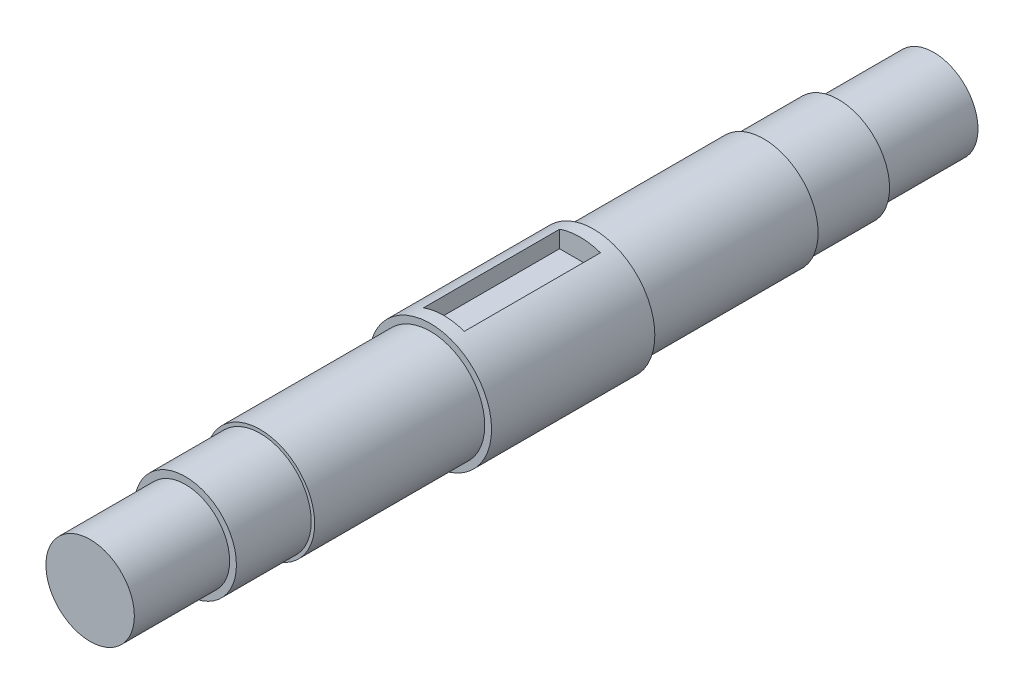
ISO-10303-21;
HEADER;
FILE_DESCRIPTION(('STEP AP214'),'2;1');
FILE_NAME('part.step','',(''),(''),'','','');
FILE_SCHEMA(('AUTOMOTIVE_DESIGN { 1 0 10303 214 1 1 1 1 }'));
ENDSEC;
DATA;
#1=APPLICATION_CONTEXT('core data for automotive mechanical design processes');
#2=APPLICATION_PROTOCOL_DEFINITION('international standard','automotive_design',2000,#1);
#3=PRODUCT_CONTEXT('',#1,'mechanical');
#4=PRODUCT('Part','Part','',(#3));
#5=PRODUCT_RELATED_PRODUCT_CATEGORY('part','',(#4));
#6=PRODUCT_DEFINITION_FORMATION('','',#4);
#7=PRODUCT_DEFINITION_CONTEXT('part definition',#1,'design');
#8=PRODUCT_DEFINITION('design','',#6,#7);
#9=PRODUCT_DEFINITION_SHAPE('','',#8);
#10=(LENGTH_UNIT() NAMED_UNIT(*) SI_UNIT(.MILLI.,.METRE.));
#11=(NAMED_UNIT(*) PLANE_ANGLE_UNIT() SI_UNIT($,.RADIAN.));
#12=(NAMED_UNIT(*) SI_UNIT($,.STERADIAN.) SOLID_ANGLE_UNIT());
#13=UNCERTAINTY_MEASURE_WITH_UNIT(LENGTH_MEASURE(1.E-05),#10,'distance_accuracy_value','');
#14=(GEOMETRIC_REPRESENTATION_CONTEXT(3) GLOBAL_UNCERTAINTY_ASSIGNED_CONTEXT((#13)) GLOBAL_UNIT_ASSIGNED_CONTEXT((#10,
#11,#12)) REPRESENTATION_CONTEXT('',''));
#15=CARTESIAN_POINT('',(0.,0.,0.));
#16=DIRECTION('',(0.,0.,1.));
#17=DIRECTION('',(1.,0.,0.));
#18=AXIS2_PLACEMENT_3D('',#15,#16,#17);
#19=CARTESIAN_POINT('',(0.,0.,14.));
#20=DIRECTION('',(0.,0.,-1.));
#21=DIRECTION('',(-1.,0.,0.));
#22=AXIS2_PLACEMENT_3D('',#19,#20,#21);
#23=CYLINDRICAL_SURFACE('',#22,6.5);
#24=CARTESIAN_POINT('',(0.,0.,14.));
#25=DIRECTION('',(0.,0.,1.));
#26=DIRECTION('',(1.,0.,0.));
#27=AXIS2_PLACEMENT_3D('',#24,#25,#26);
#28=CIRCLE('',#27,6.5);
#29=CARTESIAN_POINT('',(6.5,0.,14.));
#30=VERTEX_POINT('',#29);
#31=EDGE_CURVE('E143',#30,#30,#28,.T.);
#32=ORIENTED_EDGE('',*,*,#31,.F.);
#33=EDGE_LOOP('',(#32));
#34=FACE_BOUND('',#33,.T.);
#35=CARTESIAN_POINT('',(0.,0.,0.));
#36=DIRECTION('',(0.,0.,1.));
#37=DIRECTION('',(1.,0.,0.));
#38=AXIS2_PLACEMENT_3D('',#35,#36,#37);
#39=CIRCLE('',#38,6.5);
#40=CARTESIAN_POINT('',(6.5,0.,0.));
#41=VERTEX_POINT('',#40);
#42=EDGE_CURVE('E145',#41,#41,#39,.T.);
#43=ORIENTED_EDGE('',*,*,#42,.T.);
#44=EDGE_LOOP('',(#43));
#45=FACE_BOUND('',#44,.T.);
#46=ADVANCED_FACE('F39',(#34,#45),#23,.T.);
#47=CARTESIAN_POINT('',(0.,0.,0.));
#48=DIRECTION('',(0.,0.,1.));
#49=DIRECTION('',(1.,0.,0.));
#50=AXIS2_PLACEMENT_3D('',#47,#48,#49);
#51=PLANE('',#50);
#52=ORIENTED_EDGE('',*,*,#42,.F.);
#53=EDGE_LOOP('',(#52));
#54=FACE_BOUND('',#53,.T.);
#55=ADVANCED_FACE('F169',(#54),#51,.F.);
#56=CARTESIAN_POINT('',(0.,0.,25.));
#57=DIRECTION('',(0.,0.,-1.));
#58=DIRECTION('',(-1.,0.,0.));
#59=AXIS2_PLACEMENT_3D('',#56,#57,#58);
#60=CYLINDRICAL_SURFACE('',#59,7.5);
#61=CARTESIAN_POINT('',(0.,0.,25.));
#62=DIRECTION('',(0.,0.,1.));
#63=DIRECTION('',(1.,0.,0.));
#64=AXIS2_PLACEMENT_3D('',#61,#62,#63);
#65=CIRCLE('',#64,7.5);
#66=CARTESIAN_POINT('',(7.5,0.,25.));
#67=VERTEX_POINT('',#66);
#68=EDGE_CURVE('E139',#67,#67,#65,.T.);
#69=ORIENTED_EDGE('',*,*,#68,.F.);
#70=EDGE_LOOP('',(#69));
#71=FACE_BOUND('',#70,.T.);
#72=CARTESIAN_POINT('',(0.,0.,14.));
#73=DIRECTION('',(0.,0.,1.));
#74=DIRECTION('',(1.,0.,0.));
#75=AXIS2_PLACEMENT_3D('',#72,#73,#74);
#76=CIRCLE('',#75,7.5);
#77=CARTESIAN_POINT('',(7.5,0.,14.));
#78=VERTEX_POINT('',#77);
#79=EDGE_CURVE('E138',#78,#78,#76,.T.);
#80=ORIENTED_EDGE('',*,*,#79,.T.);
#81=EDGE_LOOP('',(#80));
#82=FACE_BOUND('',#81,.T.);
#83=ADVANCED_FACE('F174',(#71,#82),#60,.T.);
#84=CARTESIAN_POINT('',(0.,0.,14.));
#85=DIRECTION('',(0.,0.,1.));
#86=DIRECTION('',(1.,0.,0.));
#87=AXIS2_PLACEMENT_3D('',#84,#85,#86);
#88=PLANE('',#87);
#89=ORIENTED_EDGE('',*,*,#31,.T.);
#90=EDGE_LOOP('',(#89));
#91=FACE_BOUND('',#90,.T.);
#92=ORIENTED_EDGE('',*,*,#79,.F.);
#93=EDGE_LOOP('',(#92));
#94=FACE_BOUND('',#93,.T.);
#95=ADVANCED_FACE('F181',(#91,#94),#88,.F.);
#96=CARTESIAN_POINT('',(0.,0.,50.));
#97=DIRECTION('',(0.,0.,-1.));
#98=DIRECTION('',(-1.,0.,0.));
#99=AXIS2_PLACEMENT_3D('',#96,#97,#98);
#100=CYLINDRICAL_SURFACE('',#99,8.);
#101=CARTESIAN_POINT('',(0.,0.,50.));
#102=DIRECTION('',(0.,0.,1.));
#103=DIRECTION('',(1.,0.,0.));
#104=AXIS2_PLACEMENT_3D('',#101,#102,#103);
#105=CIRCLE('',#104,8.);
#106=CARTESIAN_POINT('',(8.,0.,50.));
#107=VERTEX_POINT('',#106);
#108=EDGE_CURVE('E133',#107,#107,#105,.T.);
#109=ORIENTED_EDGE('',*,*,#108,.F.);
#110=EDGE_LOOP('',(#109));
#111=FACE_BOUND('',#110,.T.);
#112=CARTESIAN_POINT('',(0.,0.,25.));
#113=DIRECTION('',(0.,0.,1.));
#114=DIRECTION('',(1.,0.,0.));
#115=AXIS2_PLACEMENT_3D('',#112,#113,#114);
#116=CIRCLE('',#115,8.);
#117=CARTESIAN_POINT('',(8.,0.,25.));
#118=VERTEX_POINT('',#117);
#119=EDGE_CURVE('E135',#118,#118,#116,.T.);
#120=ORIENTED_EDGE('',*,*,#119,.T.);
#121=EDGE_LOOP('',(#120));
#122=FACE_BOUND('',#121,.T.);
#123=ADVANCED_FACE('F183',(#111,#122),#100,.T.);
#124=CARTESIAN_POINT('',(0.,0.,25.));
#125=DIRECTION('',(0.,0.,1.));
#126=DIRECTION('',(1.,0.,0.));
#127=AXIS2_PLACEMENT_3D('',#124,#125,#126);
#128=PLANE('',#127);
#129=ORIENTED_EDGE('',*,*,#68,.T.);
#130=EDGE_LOOP('',(#129));
#131=FACE_BOUND('',#130,.T.);
#132=ORIENTED_EDGE('',*,*,#119,.F.);
#133=EDGE_LOOP('',(#132));
#134=FACE_BOUND('',#133,.T.);
#135=ADVANCED_FACE('F200',(#131,#134),#128,.F.);
#136=CARTESIAN_POINT('',(0.,0.,62.));
#137=DIRECTION('',(0.,0.,-1.));
#138=DIRECTION('',(-1.,0.,0.));
#139=AXIS2_PLACEMENT_3D('',#136,#137,#138);
#140=CYLINDRICAL_SURFACE('',#139,9.);
#141=DIRECTION('',(0.,0.,-1.));
#142=VECTOR('',#141,1.);
#143=CARTESIAN_POINT('',(3.00000000000001,8.48528137423857,62.));
#144=LINE('',#143,#142);
#145=CARTESIAN_POINT('',(3.00000000000001,8.48528137423857,52.));
#146=VERTEX_POINT('',#145);
#147=CARTESIAN_POINT('',(3.00000000000001,8.48528137423857,72.));
#148=VERTEX_POINT('',#147);
#149=EDGE_CURVE('E11',#146,#148,#144,.F.);
#150=ORIENTED_EDGE('',*,*,#149,.T.);
#151=CARTESIAN_POINT('',(0.,0.,72.));
#152=DIRECTION('',(0.,0.,1.));
#153=DIRECTION('',(1.,0.,0.));
#154=AXIS2_PLACEMENT_3D('',#151,#152,#153);
#155=CIRCLE('',#154,9.);
#156=CARTESIAN_POINT('',(-2.99999999999999,8.48528137423857,72.));
#157=VERTEX_POINT('',#156);
#158=EDGE_CURVE('E150',#148,#157,#155,.T.);
#159=ORIENTED_EDGE('',*,*,#158,.T.);
#160=DIRECTION('',(0.,0.,-1.));
#161=VECTOR('',#160,1.);
#162=CARTESIAN_POINT('',(-2.99999999999999,8.48528137423857,62.));
#163=LINE('',#162,#161);
#164=CARTESIAN_POINT('',(-2.99999999999999,8.48528137423857,52.));
#165=VERTEX_POINT('',#164);
#166=EDGE_CURVE('E46',#157,#165,#163,.T.);
#167=ORIENTED_EDGE('',*,*,#166,.T.);
#168=CARTESIAN_POINT('',(0.,0.,52.));
#169=DIRECTION('',(0.,0.,-1.));
#170=DIRECTION('',(-1.,0.,0.));
#171=AXIS2_PLACEMENT_3D('',#168,#169,#170);
#172=CIRCLE('',#171,9.);
#173=EDGE_CURVE('E64',#165,#146,#172,.T.);
#174=ORIENTED_EDGE('',*,*,#173,.T.);
#175=EDGE_LOOP('',(#150,#159,#167,#174));
#176=FACE_BOUND('',#175,.T.);
#177=CARTESIAN_POINT('',(0.,0.,50.));
#178=DIRECTION('',(0.,0.,1.));
#179=DIRECTION('',(1.,0.,0.));
#180=AXIS2_PLACEMENT_3D('',#177,#178,#179);
#181=CIRCLE('',#180,9.);
#182=CARTESIAN_POINT('',(9.,0.,50.));
#183=VERTEX_POINT('',#182);
#184=EDGE_CURVE('E126',#183,#183,#181,.T.);
#185=ORIENTED_EDGE('',*,*,#184,.T.);
#186=EDGE_LOOP('',(#185));
#187=FACE_BOUND('',#186,.T.);
#188=CARTESIAN_POINT('',(0.,0.,74.));
#189=DIRECTION('',(0.,0.,1.));
#190=DIRECTION('',(1.,0.,0.));
#191=AXIS2_PLACEMENT_3D('',#188,#189,#190);
#192=CIRCLE('',#191,9.);
#193=CARTESIAN_POINT('',(9.,0.,74.));
#194=VERTEX_POINT('',#193);
#195=EDGE_CURVE('E102',#194,#194,#192,.T.);
#196=ORIENTED_EDGE('',*,*,#195,.F.);
#197=EDGE_LOOP('',(#196));
#198=FACE_BOUND('',#197,.T.);
#199=ADVANCED_FACE('F153',(#176,#187,#198),#140,.T.);
#200=CARTESIAN_POINT('',(0.,0.,50.));
#201=DIRECTION('',(0.,0.,1.));
#202=DIRECTION('',(1.,0.,0.));
#203=AXIS2_PLACEMENT_3D('',#200,#201,#202);
#204=PLANE('',#203);
#205=ORIENTED_EDGE('',*,*,#108,.T.);
#206=EDGE_LOOP('',(#205));
#207=FACE_BOUND('',#206,.T.);
#208=ORIENTED_EDGE('',*,*,#184,.F.);
#209=EDGE_LOOP('',(#208));
#210=FACE_BOUND('',#209,.T.);
#211=ADVANCED_FACE('F204',(#207,#210),#204,.F.);
#212=CARTESIAN_POINT('',(0.,0.,110.));
#213=DIRECTION('',(0.,0.,1.));
#214=DIRECTION('',(-1.,0.,0.));
#215=AXIS2_PLACEMENT_3D('',#212,#213,#214);
#216=CYLINDRICAL_SURFACE('',#215,6.5);
#217=CARTESIAN_POINT('',(0.,0.,110.));
#218=DIRECTION('',(0.,0.,1.));
#219=DIRECTION('',(1.,0.,0.));
#220=AXIS2_PLACEMENT_3D('',#217,#218,#219);
#221=CIRCLE('',#220,6.5);
#222=CARTESIAN_POINT('',(6.5,0.,110.));
#223=VERTEX_POINT('',#222);
#224=EDGE_CURVE('E121',#223,#223,#221,.T.);
#225=ORIENTED_EDGE('',*,*,#224,.T.);
#226=EDGE_LOOP('',(#225));
#227=FACE_BOUND('',#226,.T.);
#228=CARTESIAN_POINT('',(0.,0.,124.));
#229=DIRECTION('',(0.,0.,1.));
#230=DIRECTION('',(1.,0.,0.));
#231=AXIS2_PLACEMENT_3D('',#228,#229,#230);
#232=CIRCLE('',#231,6.5);
#233=CARTESIAN_POINT('',(6.5,0.,124.));
#234=VERTEX_POINT('',#233);
#235=EDGE_CURVE('E122',#234,#234,#232,.T.);
#236=ORIENTED_EDGE('',*,*,#235,.F.);
#237=EDGE_LOOP('',(#236));
#238=FACE_BOUND('',#237,.T.);
#239=ADVANCED_FACE('F207',(#227,#238),#216,.T.);
#240=CARTESIAN_POINT('',(0.,0.,124.));
#241=DIRECTION('',(0.,0.,-1.));
#242=DIRECTION('',(1.,0.,0.));
#243=AXIS2_PLACEMENT_3D('',#240,#241,#242);
#244=PLANE('',#243);
#245=ORIENTED_EDGE('',*,*,#235,.T.);
#246=EDGE_LOOP('',(#245));
#247=FACE_BOUND('',#246,.T.);
#248=ADVANCED_FACE('F208',(#247),#244,.F.);
#249=CARTESIAN_POINT('',(0.,0.,99.));
#250=DIRECTION('',(0.,0.,1.));
#251=DIRECTION('',(-1.,0.,0.));
#252=AXIS2_PLACEMENT_3D('',#249,#250,#251);
#253=CYLINDRICAL_SURFACE('',#252,7.5);
#254=CARTESIAN_POINT('',(0.,0.,99.));
#255=DIRECTION('',(0.,0.,1.));
#256=DIRECTION('',(1.,0.,0.));
#257=AXIS2_PLACEMENT_3D('',#254,#255,#256);
#258=CIRCLE('',#257,7.5);
#259=CARTESIAN_POINT('',(7.5,0.,99.));
#260=VERTEX_POINT('',#259);
#261=EDGE_CURVE('E117',#260,#260,#258,.T.);
#262=ORIENTED_EDGE('',*,*,#261,.T.);
#263=EDGE_LOOP('',(#262));
#264=FACE_BOUND('',#263,.T.);
#265=CARTESIAN_POINT('',(0.,0.,110.));
#266=DIRECTION('',(0.,0.,1.));
#267=DIRECTION('',(1.,0.,0.));
#268=AXIS2_PLACEMENT_3D('',#265,#266,#267);
#269=CIRCLE('',#268,7.5);
#270=CARTESIAN_POINT('',(7.5,0.,110.));
#271=VERTEX_POINT('',#270);
#272=EDGE_CURVE('E114',#271,#271,#269,.T.);
#273=ORIENTED_EDGE('',*,*,#272,.F.);
#274=EDGE_LOOP('',(#273));
#275=FACE_BOUND('',#274,.T.);
#276=ADVANCED_FACE('F213',(#264,#275),#253,.T.);
#277=CARTESIAN_POINT('',(0.,0.,110.));
#278=DIRECTION('',(0.,0.,-1.));
#279=DIRECTION('',(1.,0.,0.));
#280=AXIS2_PLACEMENT_3D('',#277,#278,#279);
#281=PLANE('',#280);
#282=ORIENTED_EDGE('',*,*,#224,.F.);
#283=EDGE_LOOP('',(#282));
#284=FACE_BOUND('',#283,.T.);
#285=ORIENTED_EDGE('',*,*,#272,.T.);
#286=EDGE_LOOP('',(#285));
#287=FACE_BOUND('',#286,.T.);
#288=ADVANCED_FACE('F218',(#284,#287),#281,.F.);
#289=CARTESIAN_POINT('',(0.,0.,74.));
#290=DIRECTION('',(0.,0.,1.));
#291=DIRECTION('',(-1.,0.,0.));
#292=AXIS2_PLACEMENT_3D('',#289,#290,#291);
#293=CYLINDRICAL_SURFACE('',#292,8.);
#294=CARTESIAN_POINT('',(0.,0.,74.));
#295=DIRECTION('',(0.,0.,1.));
#296=DIRECTION('',(1.,0.,0.));
#297=AXIS2_PLACEMENT_3D('',#294,#295,#296);
#298=CIRCLE('',#297,8.);
#299=CARTESIAN_POINT('',(8.,0.,74.));
#300=VERTEX_POINT('',#299);
#301=EDGE_CURVE('E115',#300,#300,#298,.T.);
#302=ORIENTED_EDGE('',*,*,#301,.T.);
#303=EDGE_LOOP('',(#302));
#304=FACE_BOUND('',#303,.T.);
#305=CARTESIAN_POINT('',(0.,0.,99.));
#306=DIRECTION('',(0.,0.,1.));
#307=DIRECTION('',(1.,0.,0.));
#308=AXIS2_PLACEMENT_3D('',#305,#306,#307);
#309=CIRCLE('',#308,8.);
#310=CARTESIAN_POINT('',(8.,0.,99.));
#311=VERTEX_POINT('',#310);
#312=EDGE_CURVE('E111',#311,#311,#309,.T.);
#313=ORIENTED_EDGE('',*,*,#312,.F.);
#314=EDGE_LOOP('',(#313));
#315=FACE_BOUND('',#314,.T.);
#316=ADVANCED_FACE('F225',(#304,#315),#293,.T.);
#317=CARTESIAN_POINT('',(0.,0.,99.));
#318=DIRECTION('',(0.,0.,-1.));
#319=DIRECTION('',(1.,0.,0.));
#320=AXIS2_PLACEMENT_3D('',#317,#318,#319);
#321=PLANE('',#320);
#322=ORIENTED_EDGE('',*,*,#261,.F.);
#323=EDGE_LOOP('',(#322));
#324=FACE_BOUND('',#323,.T.);
#325=ORIENTED_EDGE('',*,*,#312,.T.);
#326=EDGE_LOOP('',(#325));
#327=FACE_BOUND('',#326,.T.);
#328=ADVANCED_FACE('F228',(#324,#327),#321,.F.);
#329=CARTESIAN_POINT('',(0.,0.,74.));
#330=DIRECTION('',(0.,0.,-1.));
#331=DIRECTION('',(1.,0.,0.));
#332=AXIS2_PLACEMENT_3D('',#329,#330,#331);
#333=PLANE('',#332);
#334=ORIENTED_EDGE('',*,*,#301,.F.);
#335=EDGE_LOOP('',(#334));
#336=FACE_BOUND('',#335,.T.);
#337=ORIENTED_EDGE('',*,*,#195,.T.);
#338=EDGE_LOOP('',(#337));
#339=FACE_BOUND('',#338,.T.);
#340=ADVANCED_FACE('F164',(#336,#339),#333,.F.);
#341=CARTESIAN_POINT('',(-2.99999999999999,6.,72.));
#342=DIRECTION('',(-1.,0.,0.));
#343=DIRECTION('',(0.,0.,1.));
#344=AXIS2_PLACEMENT_3D('',#341,#342,#343);
#345=PLANE('',#344);
#346=DIRECTION('',(0.,1.,0.));
#347=VECTOR('',#346,1.);
#348=CARTESIAN_POINT('',(-2.99999999999999,6.,72.));
#349=LINE('',#348,#347);
#350=CARTESIAN_POINT('',(-2.99999999999999,6.,72.));
#351=VERTEX_POINT('',#350);
#352=EDGE_CURVE('E52',#351,#157,#349,.T.);
#353=ORIENTED_EDGE('',*,*,#352,.F.);
#354=DIRECTION('',(0.,0.,1.));
#355=VECTOR('',#354,1.);
#356=CARTESIAN_POINT('',(-2.99999999999999,6.,72.));
#357=LINE('',#356,#355);
#358=CARTESIAN_POINT('',(-2.99999999999999,6.,52.));
#359=VERTEX_POINT('',#358);
#360=EDGE_CURVE('E84',#359,#351,#357,.T.);
#361=ORIENTED_EDGE('',*,*,#360,.F.);
#362=DIRECTION('',(0.,1.,0.));
#363=VECTOR('',#362,1.);
#364=CARTESIAN_POINT('',(-2.99999999999999,6.,52.));
#365=LINE('',#364,#363);
#366=EDGE_CURVE('E101',#359,#165,#365,.T.);
#367=ORIENTED_EDGE('',*,*,#366,.T.);
#368=ORIENTED_EDGE('',*,*,#166,.F.);
#369=EDGE_LOOP('',(#353,#361,#367,#368));
#370=FACE_BOUND('',#369,.T.);
#371=ADVANCED_FACE('F79',(#370),#345,.F.);
#372=CARTESIAN_POINT('',(3.00000000000001,6.,52.));
#373=DIRECTION('',(0.,0.,-1.));
#374=DIRECTION('',(-1.,0.,0.));
#375=AXIS2_PLACEMENT_3D('',#372,#373,#374);
#376=PLANE('',#375);
#377=ORIENTED_EDGE('',*,*,#366,.F.);
#378=DIRECTION('',(-1.,0.,0.));
#379=VECTOR('',#378,1.);
#380=CARTESIAN_POINT('',(3.00000000000001,6.,52.));
#381=LINE('',#380,#379);
#382=CARTESIAN_POINT('',(3.00000000000001,6.,52.));
#383=VERTEX_POINT('',#382);
#384=EDGE_CURVE('E86',#383,#359,#381,.T.);
#385=ORIENTED_EDGE('',*,*,#384,.F.);
#386=DIRECTION('',(0.,1.,0.));
#387=VECTOR('',#386,1.);
#388=CARTESIAN_POINT('',(3.00000000000001,6.,52.));
#389=LINE('',#388,#387);
#390=EDGE_CURVE('E106',#383,#146,#389,.T.);
#391=ORIENTED_EDGE('',*,*,#390,.T.);
#392=ORIENTED_EDGE('',*,*,#173,.F.);
#393=EDGE_LOOP('',(#377,#385,#391,#392));
#394=FACE_BOUND('',#393,.T.);
#395=ADVANCED_FACE('F160',(#394),#376,.F.);
#396=CARTESIAN_POINT('',(3.00000000000001,6.,72.));
#397=DIRECTION('',(1.,0.,0.));
#398=DIRECTION('',(0.,0.,-1.));
#399=AXIS2_PLACEMENT_3D('',#396,#397,#398);
#400=PLANE('',#399);
#401=ORIENTED_EDGE('',*,*,#390,.F.);
#402=DIRECTION('',(0.,0.,-1.));
#403=VECTOR('',#402,1.);
#404=CARTESIAN_POINT('',(3.00000000000001,6.,72.));
#405=LINE('',#404,#403);
#406=CARTESIAN_POINT('',(3.00000000000001,6.,72.));
#407=VERTEX_POINT('',#406);
#408=EDGE_CURVE('E92',#407,#383,#405,.T.);
#409=ORIENTED_EDGE('',*,*,#408,.F.);
#410=DIRECTION('',(0.,1.,0.));
#411=VECTOR('',#410,1.);
#412=CARTESIAN_POINT('',(3.00000000000001,6.,72.));
#413=LINE('',#412,#411);
#414=EDGE_CURVE('E82',#407,#148,#413,.T.);
#415=ORIENTED_EDGE('',*,*,#414,.T.);
#416=ORIENTED_EDGE('',*,*,#149,.F.);
#417=EDGE_LOOP('',(#401,#409,#415,#416));
#418=FACE_BOUND('',#417,.T.);
#419=ADVANCED_FACE('F158',(#418),#400,.F.);
#420=CARTESIAN_POINT('',(3.00000000000001,6.,72.));
#421=DIRECTION('',(0.,0.,1.));
#422=DIRECTION('',(1.,0.,0.));
#423=AXIS2_PLACEMENT_3D('',#420,#421,#422);
#424=PLANE('',#423);
#425=ORIENTED_EDGE('',*,*,#414,.F.);
#426=DIRECTION('',(1.,0.,0.));
#427=VECTOR('',#426,1.);
#428=CARTESIAN_POINT('',(3.00000000000001,6.,72.));
#429=LINE('',#428,#427);
#430=EDGE_CURVE('E87',#351,#407,#429,.T.);
#431=ORIENTED_EDGE('',*,*,#430,.F.);
#432=ORIENTED_EDGE('',*,*,#352,.T.);
#433=ORIENTED_EDGE('',*,*,#158,.F.);
#434=EDGE_LOOP('',(#425,#431,#432,#433));
#435=FACE_BOUND('',#434,.T.);
#436=ADVANCED_FACE('F89',(#435),#424,.F.);
#437=CARTESIAN_POINT('',(0.,6.,0.));
#438=DIRECTION('',(0.,1.,0.));
#439=DIRECTION('',(0.,0.,1.));
#440=AXIS2_PLACEMENT_3D('',#437,#438,#439);
#441=PLANE('',#440);
#442=ORIENTED_EDGE('',*,*,#360,.T.);
#443=ORIENTED_EDGE('',*,*,#430,.T.);
#444=ORIENTED_EDGE('',*,*,#408,.T.);
#445=ORIENTED_EDGE('',*,*,#384,.T.);
#446=EDGE_LOOP('',(#442,#443,#444,#445));
#447=FACE_BOUND('',#446,.T.);
#448=ADVANCED_FACE('F97',(#447),#441,.T.);
#449=CLOSED_SHELL('',(#46,#55,#83,#95,#123,#135,#199,#211,#239,#248,#276,#288,#316,#328,#340,
#371,#395,#419,#436,#448));
#450=MANIFOLD_SOLID_BREP('B2',#449);
#451=ADVANCED_BREP_SHAPE_REPRESENTATION('',(#18,#450),#14);
#452=SHAPE_DEFINITION_REPRESENTATION(#9,#451);
ENDSEC;
END-ISO-10303-21;
